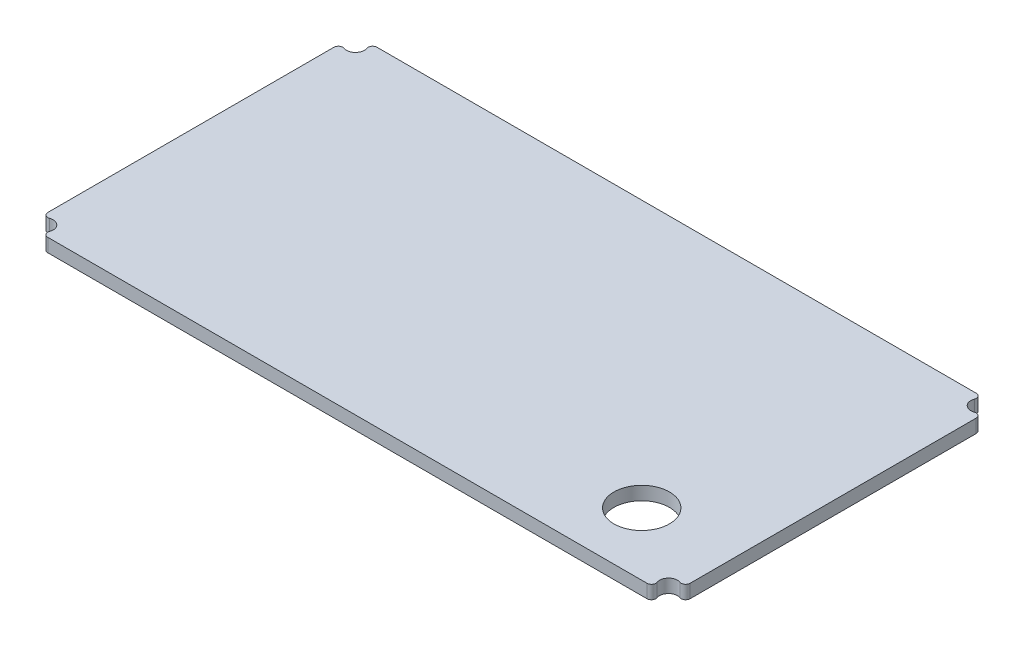
ISO-10303-21;
HEADER;
FILE_DESCRIPTION(('STEP AP214'),'2;1');
FILE_NAME('part.step','',(''),(''),'','','');
FILE_SCHEMA(('AUTOMOTIVE_DESIGN { 1 0 10303 214 1 1 1 1 }'));
ENDSEC;
DATA;
#1=APPLICATION_CONTEXT('core data for automotive mechanical design processes');
#2=APPLICATION_PROTOCOL_DEFINITION('international standard','automotive_design',2000,#1);
#3=PRODUCT_CONTEXT('',#1,'mechanical');
#4=PRODUCT('Part','Part','',(#3));
#5=PRODUCT_RELATED_PRODUCT_CATEGORY('part','',(#4));
#6=PRODUCT_DEFINITION_FORMATION('','',#4);
#7=PRODUCT_DEFINITION_CONTEXT('part definition',#1,'design');
#8=PRODUCT_DEFINITION('design','',#6,#7);
#9=PRODUCT_DEFINITION_SHAPE('','',#8);
#10=(LENGTH_UNIT() NAMED_UNIT(*) SI_UNIT(.MILLI.,.METRE.));
#11=(NAMED_UNIT(*) PLANE_ANGLE_UNIT() SI_UNIT($,.RADIAN.));
#12=(NAMED_UNIT(*) SI_UNIT($,.STERADIAN.) SOLID_ANGLE_UNIT());
#13=UNCERTAINTY_MEASURE_WITH_UNIT(LENGTH_MEASURE(1.E-05),#10,'distance_accuracy_value','');
#14=(GEOMETRIC_REPRESENTATION_CONTEXT(3) GLOBAL_UNCERTAINTY_ASSIGNED_CONTEXT((#13)) GLOBAL_UNIT_ASSIGNED_CONTEXT((#10,
#11,#12)) REPRESENTATION_CONTEXT('',''));
#15=CARTESIAN_POINT('',(0.,0.,0.));
#16=DIRECTION('',(0.,0.,1.));
#17=DIRECTION('',(1.,0.,0.));
#18=AXIS2_PLACEMENT_3D('',#15,#16,#17);
#19=CARTESIAN_POINT('',(69.3857864376269,1.5,-36.3));
#20=DIRECTION('',(0.,-1.,0.));
#21=DIRECTION('',(0.,0.,-1.));
#22=AXIS2_PLACEMENT_3D('',#19,#20,#21);
#23=CYLINDRICAL_SURFACE('',#22,0.499999999999999);
#24=CARTESIAN_POINT('',(69.3857864376269,0.,-36.3));
#25=DIRECTION('',(0.,1.,0.));
#26=DIRECTION('',(0.,0.,1.));
#27=AXIS2_PLACEMENT_3D('',#24,#25,#26);
#28=CIRCLE('',#27,0.499999999999999);
#29=CARTESIAN_POINT('',(69.8571909584179,0.,-36.1333333333333));
#30=VERTEX_POINT('',#29);
#31=CARTESIAN_POINT('',(69.3857864376269,0.,-36.8));
#32=VERTEX_POINT('',#31);
#33=EDGE_CURVE('E177',#30,#32,#28,.T.);
#34=ORIENTED_EDGE('',*,*,#33,.T.);
#35=DIRECTION('',(0.,-1.,0.));
#36=VECTOR('',#35,1.);
#37=CARTESIAN_POINT('',(69.3857864376269,1.5,-36.8));
#38=LINE('',#37,#36);
#39=CARTESIAN_POINT('',(69.3857864376269,1.5,-36.8));
#40=VERTEX_POINT('',#39);
#41=EDGE_CURVE('E11',#40,#32,#38,.T.);
#42=ORIENTED_EDGE('',*,*,#41,.F.);
#43=CARTESIAN_POINT('',(69.3857864376269,1.5,-36.3));
#44=DIRECTION('',(0.,1.,0.));
#45=DIRECTION('',(0.,0.,1.));
#46=AXIS2_PLACEMENT_3D('',#43,#44,#45);
#47=CIRCLE('',#46,0.499999999999999);
#48=CARTESIAN_POINT('',(69.8571909584179,1.5,-36.1333333333333));
#49=VERTEX_POINT('',#48);
#50=EDGE_CURVE('E208',#49,#40,#47,.T.);
#51=ORIENTED_EDGE('',*,*,#50,.F.);
#52=DIRECTION('',(0.,-1.,0.));
#53=VECTOR('',#52,1.);
#54=CARTESIAN_POINT('',(69.8571909584179,1.5,-36.1333333333333));
#55=LINE('',#54,#53);
#56=EDGE_CURVE('E173',#49,#30,#55,.T.);
#57=ORIENTED_EDGE('',*,*,#56,.T.);
#58=EDGE_LOOP('',(#34,#42,#51,#57));
#59=FACE_BOUND('',#58,.T.);
#60=ADVANCED_FACE('F33',(#59),#23,.T.);
#61=CARTESIAN_POINT('',(2.4142135623731,1.5,-36.8));
#62=DIRECTION('',(0.,0.,1.));
#63=DIRECTION('',(1.,0.,0.));
#64=AXIS2_PLACEMENT_3D('',#61,#62,#63);
#65=PLANE('',#64);
#66=DIRECTION('',(-1.,0.,0.));
#67=VECTOR('',#66,1.);
#68=CARTESIAN_POINT('',(2.4142135623731,0.,-36.8));
#69=LINE('',#68,#67);
#70=CARTESIAN_POINT('',(2.4142135623731,0.,-36.8));
#71=VERTEX_POINT('',#70);
#72=EDGE_CURVE('E180',#32,#71,#69,.T.);
#73=ORIENTED_EDGE('',*,*,#72,.T.);
#74=DIRECTION('',(0.,-1.,0.));
#75=VECTOR('',#74,1.);
#76=CARTESIAN_POINT('',(2.4142135623731,1.5,-36.8));
#77=LINE('',#76,#75);
#78=CARTESIAN_POINT('',(2.4142135623731,1.5,-36.8));
#79=VERTEX_POINT('',#78);
#80=EDGE_CURVE('E41',#79,#71,#77,.T.);
#81=ORIENTED_EDGE('',*,*,#80,.F.);
#82=DIRECTION('',(-1.,0.,0.));
#83=VECTOR('',#82,1.);
#84=CARTESIAN_POINT('',(2.4142135623731,1.5,-36.8));
#85=LINE('',#84,#83);
#86=EDGE_CURVE('E116',#40,#79,#85,.T.);
#87=ORIENTED_EDGE('',*,*,#86,.F.);
#88=ORIENTED_EDGE('',*,*,#41,.T.);
#89=EDGE_LOOP('',(#73,#81,#87,#88));
#90=FACE_BOUND('',#89,.T.);
#91=ADVANCED_FACE('F307',(#90),#65,.F.);
#92=CARTESIAN_POINT('',(2.4142135623731,1.5,-36.3));
#93=DIRECTION('',(0.,-1.,0.));
#94=DIRECTION('',(0.,0.,-1.));
#95=AXIS2_PLACEMENT_3D('',#92,#93,#94);
#96=CYLINDRICAL_SURFACE('',#95,0.500000000000001);
#97=CARTESIAN_POINT('',(2.4142135623731,0.,-36.3));
#98=DIRECTION('',(0.,1.,0.));
#99=DIRECTION('',(0.,0.,1.));
#100=AXIS2_PLACEMENT_3D('',#97,#98,#99);
#101=CIRCLE('',#100,0.500000000000001);
#102=CARTESIAN_POINT('',(1.94280904158206,0.,-36.1333333333333));
#103=VERTEX_POINT('',#102);
#104=EDGE_CURVE('E183',#71,#103,#101,.T.);
#105=ORIENTED_EDGE('',*,*,#104,.T.);
#106=DIRECTION('',(0.,-1.,0.));
#107=VECTOR('',#106,1.);
#108=CARTESIAN_POINT('',(1.94280904158206,1.5,-36.1333333333333));
#109=LINE('',#108,#107);
#110=CARTESIAN_POINT('',(1.94280904158206,1.5,-36.1333333333333));
#111=VERTEX_POINT('',#110);
#112=EDGE_CURVE('E239',#111,#103,#109,.T.);
#113=ORIENTED_EDGE('',*,*,#112,.F.);
#114=CARTESIAN_POINT('',(2.4142135623731,1.5,-36.3));
#115=DIRECTION('',(0.,1.,0.));
#116=DIRECTION('',(0.,0.,1.));
#117=AXIS2_PLACEMENT_3D('',#114,#115,#116);
#118=CIRCLE('',#117,0.500000000000001);
#119=EDGE_CURVE('E247',#79,#111,#118,.T.);
#120=ORIENTED_EDGE('',*,*,#119,.F.);
#121=ORIENTED_EDGE('',*,*,#80,.T.);
#122=EDGE_LOOP('',(#105,#113,#120,#121));
#123=FACE_BOUND('',#122,.T.);
#124=ADVANCED_FACE('F245',(#123),#96,.T.);
#125=CARTESIAN_POINT('',(1.,1.5,-35.8));
#126=DIRECTION('',(0.,-1.,0.));
#127=DIRECTION('',(0.,0.,-1.));
#128=AXIS2_PLACEMENT_3D('',#125,#126,#127);
#129=CYLINDRICAL_SURFACE('',#128,0.999999999999998);
#130=CARTESIAN_POINT('',(1.,0.,-35.8));
#131=DIRECTION('',(0.,-1.,0.));
#132=DIRECTION('',(0.,0.,1.));
#133=AXIS2_PLACEMENT_3D('',#130,#131,#132);
#134=CIRCLE('',#133,0.999999999999998);
#135=CARTESIAN_POINT('',(0.666666666666666,0.,-34.8571909584179));
#136=VERTEX_POINT('',#135);
#137=EDGE_CURVE('E185',#103,#136,#134,.T.);
#138=ORIENTED_EDGE('',*,*,#137,.T.);
#139=DIRECTION('',(0.,-1.,0.));
#140=VECTOR('',#139,1.);
#141=CARTESIAN_POINT('',(0.666666666666666,1.5,-34.8571909584179));
#142=LINE('',#141,#140);
#143=CARTESIAN_POINT('',(0.666666666666666,1.5,-34.8571909584179));
#144=VERTEX_POINT('',#143);
#145=EDGE_CURVE('E236',#144,#136,#142,.T.);
#146=ORIENTED_EDGE('',*,*,#145,.F.);
#147=CARTESIAN_POINT('',(1.,1.5,-35.8));
#148=DIRECTION('',(0.,-1.,0.));
#149=DIRECTION('',(0.,0.,1.));
#150=AXIS2_PLACEMENT_3D('',#147,#148,#149);
#151=CIRCLE('',#150,0.999999999999998);
#152=EDGE_CURVE('E265',#111,#144,#151,.T.);
#153=ORIENTED_EDGE('',*,*,#152,.F.);
#154=ORIENTED_EDGE('',*,*,#112,.T.);
#155=EDGE_LOOP('',(#138,#146,#153,#154));
#156=FACE_BOUND('',#155,.T.);
#157=ADVANCED_FACE('F256',(#156),#129,.F.);
#158=CARTESIAN_POINT('',(0.5,1.5,-34.3857864376269));
#159=DIRECTION('',(0.,-1.,0.));
#160=DIRECTION('',(0.,0.,-1.));
#161=AXIS2_PLACEMENT_3D('',#158,#159,#160);
#162=CYLINDRICAL_SURFACE('',#161,0.500000000000003);
#163=CARTESIAN_POINT('',(0.5,0.,-34.3857864376269));
#164=DIRECTION('',(0.,1.,0.));
#165=DIRECTION('',(0.,0.,-1.));
#166=AXIS2_PLACEMENT_3D('',#163,#164,#165);
#167=CIRCLE('',#166,0.500000000000003);
#168=CARTESIAN_POINT('',(0.,0.,-34.3857864376269));
#169=VERTEX_POINT('',#168);
#170=EDGE_CURVE('E187',#136,#169,#167,.T.);
#171=ORIENTED_EDGE('',*,*,#170,.T.);
#172=DIRECTION('',(0.,-1.,0.));
#173=VECTOR('',#172,1.);
#174=CARTESIAN_POINT('',(0.,1.5,-34.3857864376269));
#175=LINE('',#174,#173);
#176=CARTESIAN_POINT('',(0.,1.5,-34.3857864376269));
#177=VERTEX_POINT('',#176);
#178=EDGE_CURVE('E233',#177,#169,#175,.T.);
#179=ORIENTED_EDGE('',*,*,#178,.F.);
#180=CARTESIAN_POINT('',(0.5,1.5,-34.3857864376269));
#181=DIRECTION('',(0.,1.,0.));
#182=DIRECTION('',(0.,0.,-1.));
#183=AXIS2_PLACEMENT_3D('',#180,#181,#182);
#184=CIRCLE('',#183,0.500000000000003);
#185=EDGE_CURVE('E262',#144,#177,#184,.T.);
#186=ORIENTED_EDGE('',*,*,#185,.F.);
#187=ORIENTED_EDGE('',*,*,#145,.T.);
#188=EDGE_LOOP('',(#171,#179,#186,#187));
#189=FACE_BOUND('',#188,.T.);
#190=ADVANCED_FACE('F260',(#189),#162,.T.);
#191=CARTESIAN_POINT('',(0.,1.5,-2.4142135623731));
#192=DIRECTION('',(1.,0.,0.));
#193=DIRECTION('',(0.,0.,-1.));
#194=AXIS2_PLACEMENT_3D('',#191,#192,#193);
#195=PLANE('',#194);
#196=DIRECTION('',(0.,0.,1.));
#197=VECTOR('',#196,1.);
#198=CARTESIAN_POINT('',(0.,0.,-2.4142135623731));
#199=LINE('',#198,#197);
#200=CARTESIAN_POINT('',(0.,0.,-2.4142135623731));
#201=VERTEX_POINT('',#200);
#202=EDGE_CURVE('E189',#169,#201,#199,.T.);
#203=ORIENTED_EDGE('',*,*,#202,.T.);
#204=DIRECTION('',(0.,-1.,0.));
#205=VECTOR('',#204,1.);
#206=CARTESIAN_POINT('',(0.,1.5,-2.4142135623731));
#207=LINE('',#206,#205);
#208=CARTESIAN_POINT('',(0.,1.5,-2.4142135623731));
#209=VERTEX_POINT('',#208);
#210=EDGE_CURVE('E230',#209,#201,#207,.T.);
#211=ORIENTED_EDGE('',*,*,#210,.F.);
#212=DIRECTION('',(0.,0.,1.));
#213=VECTOR('',#212,1.);
#214=CARTESIAN_POINT('',(0.,1.5,-2.4142135623731));
#215=LINE('',#214,#213);
#216=EDGE_CURVE('E264',#177,#209,#215,.T.);
#217=ORIENTED_EDGE('',*,*,#216,.F.);
#218=ORIENTED_EDGE('',*,*,#178,.T.);
#219=EDGE_LOOP('',(#203,#211,#217,#218));
#220=FACE_BOUND('',#219,.T.);
#221=ADVANCED_FACE('F320',(#220),#195,.F.);
#222=CARTESIAN_POINT('',(0.5,1.5,-2.4142135623731));
#223=DIRECTION('',(0.,-1.,0.));
#224=DIRECTION('',(0.,0.,-1.));
#225=AXIS2_PLACEMENT_3D('',#222,#223,#224);
#226=CYLINDRICAL_SURFACE('',#225,0.5);
#227=CARTESIAN_POINT('',(0.5,0.,-2.4142135623731));
#228=DIRECTION('',(0.,1.,0.));
#229=DIRECTION('',(0.,0.,1.));
#230=AXIS2_PLACEMENT_3D('',#227,#228,#229);
#231=CIRCLE('',#230,0.5);
#232=CARTESIAN_POINT('',(0.666666666666667,0.,-1.94280904158206));
#233=VERTEX_POINT('',#232);
#234=EDGE_CURVE('E191',#201,#233,#231,.T.);
#235=ORIENTED_EDGE('',*,*,#234,.T.);
#236=DIRECTION('',(0.,-1.,0.));
#237=VECTOR('',#236,1.);
#238=CARTESIAN_POINT('',(0.666666666666667,1.5,-1.94280904158206));
#239=LINE('',#238,#237);
#240=CARTESIAN_POINT('',(0.666666666666667,1.5,-1.94280904158206));
#241=VERTEX_POINT('',#240);
#242=EDGE_CURVE('E227',#241,#233,#239,.T.);
#243=ORIENTED_EDGE('',*,*,#242,.F.);
#244=CARTESIAN_POINT('',(0.5,1.5,-2.4142135623731));
#245=DIRECTION('',(0.,1.,0.));
#246=DIRECTION('',(0.,0.,1.));
#247=AXIS2_PLACEMENT_3D('',#244,#245,#246);
#248=CIRCLE('',#247,0.5);
#249=EDGE_CURVE('E267',#209,#241,#248,.T.);
#250=ORIENTED_EDGE('',*,*,#249,.F.);
#251=ORIENTED_EDGE('',*,*,#210,.T.);
#252=EDGE_LOOP('',(#235,#243,#250,#251));
#253=FACE_BOUND('',#252,.T.);
#254=ADVANCED_FACE('F323',(#253),#226,.T.);
#255=CARTESIAN_POINT('',(1.,1.5,-1.));
#256=DIRECTION('',(0.,-1.,0.));
#257=DIRECTION('',(0.,0.,-1.));
#258=AXIS2_PLACEMENT_3D('',#255,#256,#257);
#259=CYLINDRICAL_SURFACE('',#258,1.);
#260=CARTESIAN_POINT('',(1.,0.,-1.));
#261=DIRECTION('',(0.,-1.,0.));
#262=DIRECTION('',(0.,0.,1.));
#263=AXIS2_PLACEMENT_3D('',#260,#261,#262);
#264=CIRCLE('',#263,1.);
#265=CARTESIAN_POINT('',(1.94280904158206,0.,-0.666666666666667));
#266=VERTEX_POINT('',#265);
#267=EDGE_CURVE('E193',#233,#266,#264,.T.);
#268=ORIENTED_EDGE('',*,*,#267,.T.);
#269=DIRECTION('',(0.,-1.,0.));
#270=VECTOR('',#269,1.);
#271=CARTESIAN_POINT('',(1.94280904158206,1.5,-0.666666666666667));
#272=LINE('',#271,#270);
#273=CARTESIAN_POINT('',(1.94280904158206,1.5,-0.666666666666667));
#274=VERTEX_POINT('',#273);
#275=EDGE_CURVE('E224',#274,#266,#272,.T.);
#276=ORIENTED_EDGE('',*,*,#275,.F.);
#277=CARTESIAN_POINT('',(1.,1.5,-1.));
#278=DIRECTION('',(0.,-1.,0.));
#279=DIRECTION('',(0.,0.,1.));
#280=AXIS2_PLACEMENT_3D('',#277,#278,#279);
#281=CIRCLE('',#280,1.);
#282=EDGE_CURVE('E273',#241,#274,#281,.T.);
#283=ORIENTED_EDGE('',*,*,#282,.F.);
#284=ORIENTED_EDGE('',*,*,#242,.T.);
#285=EDGE_LOOP('',(#268,#276,#283,#284));
#286=FACE_BOUND('',#285,.T.);
#287=ADVANCED_FACE('F327',(#286),#259,.F.);
#288=CARTESIAN_POINT('',(2.4142135623731,1.5,-0.5));
#289=DIRECTION('',(0.,-1.,0.));
#290=DIRECTION('',(0.,0.,-1.));
#291=AXIS2_PLACEMENT_3D('',#288,#289,#290);
#292=CYLINDRICAL_SURFACE('',#291,0.5);
#293=CARTESIAN_POINT('',(2.4142135623731,0.,-0.5));
#294=DIRECTION('',(0.,1.,0.));
#295=DIRECTION('',(0.,0.,-1.));
#296=AXIS2_PLACEMENT_3D('',#293,#294,#295);
#297=CIRCLE('',#296,0.5);
#298=CARTESIAN_POINT('',(2.4142135623731,0.,0.));
#299=VERTEX_POINT('',#298);
#300=EDGE_CURVE('E195',#266,#299,#297,.T.);
#301=ORIENTED_EDGE('',*,*,#300,.T.);
#302=DIRECTION('',(0.,-1.,0.));
#303=VECTOR('',#302,1.);
#304=CARTESIAN_POINT('',(2.4142135623731,1.5,0.));
#305=LINE('',#304,#303);
#306=CARTESIAN_POINT('',(2.4142135623731,1.5,0.));
#307=VERTEX_POINT('',#306);
#308=EDGE_CURVE('E221',#307,#299,#305,.T.);
#309=ORIENTED_EDGE('',*,*,#308,.F.);
#310=CARTESIAN_POINT('',(2.4142135623731,1.5,-0.5));
#311=DIRECTION('',(0.,1.,0.));
#312=DIRECTION('',(0.,0.,-1.));
#313=AXIS2_PLACEMENT_3D('',#310,#311,#312);
#314=CIRCLE('',#313,0.5);
#315=EDGE_CURVE('E275',#274,#307,#314,.T.);
#316=ORIENTED_EDGE('',*,*,#315,.F.);
#317=ORIENTED_EDGE('',*,*,#275,.T.);
#318=EDGE_LOOP('',(#301,#309,#316,#317));
#319=FACE_BOUND('',#318,.T.);
#320=ADVANCED_FACE('F331',(#319),#292,.T.);
#321=CARTESIAN_POINT('',(2.4142135623731,1.5,0.));
#322=DIRECTION('',(0.,0.,-1.));
#323=DIRECTION('',(-1.,0.,0.));
#324=AXIS2_PLACEMENT_3D('',#321,#322,#323);
#325=PLANE('',#324);
#326=DIRECTION('',(1.,0.,0.));
#327=VECTOR('',#326,1.);
#328=CARTESIAN_POINT('',(2.4142135623731,0.,0.));
#329=LINE('',#328,#327);
#330=CARTESIAN_POINT('',(69.3857864376269,0.,0.));
#331=VERTEX_POINT('',#330);
#332=EDGE_CURVE('E197',#299,#331,#329,.T.);
#333=ORIENTED_EDGE('',*,*,#332,.T.);
#334=DIRECTION('',(0.,-1.,0.));
#335=VECTOR('',#334,1.);
#336=CARTESIAN_POINT('',(69.3857864376269,1.5,0.));
#337=LINE('',#336,#335);
#338=CARTESIAN_POINT('',(69.3857864376269,1.5,0.));
#339=VERTEX_POINT('',#338);
#340=EDGE_CURVE('E218',#339,#331,#337,.T.);
#341=ORIENTED_EDGE('',*,*,#340,.F.);
#342=DIRECTION('',(1.,0.,0.));
#343=VECTOR('',#342,1.);
#344=CARTESIAN_POINT('',(2.4142135623731,1.5,0.));
#345=LINE('',#344,#343);
#346=EDGE_CURVE('E277',#307,#339,#345,.T.);
#347=ORIENTED_EDGE('',*,*,#346,.F.);
#348=ORIENTED_EDGE('',*,*,#308,.T.);
#349=EDGE_LOOP('',(#333,#341,#347,#348));
#350=FACE_BOUND('',#349,.T.);
#351=ADVANCED_FACE('F335',(#350),#325,.F.);
#352=CARTESIAN_POINT('',(69.3857864376269,1.5,-0.5));
#353=DIRECTION('',(0.,-1.,0.));
#354=DIRECTION('',(0.,0.,-1.));
#355=AXIS2_PLACEMENT_3D('',#352,#353,#354);
#356=CYLINDRICAL_SURFACE('',#355,0.499999999999999);
#357=CARTESIAN_POINT('',(69.3857864376269,0.,-0.5));
#358=DIRECTION('',(0.,1.,0.));
#359=DIRECTION('',(0.,0.,-1.));
#360=AXIS2_PLACEMENT_3D('',#357,#358,#359);
#361=CIRCLE('',#360,0.499999999999999);
#362=CARTESIAN_POINT('',(69.8571909584179,0.,-0.666666666666665));
#363=VERTEX_POINT('',#362);
#364=EDGE_CURVE('E199',#331,#363,#361,.T.);
#365=ORIENTED_EDGE('',*,*,#364,.T.);
#366=DIRECTION('',(0.,-1.,0.));
#367=VECTOR('',#366,1.);
#368=CARTESIAN_POINT('',(69.8571909584179,1.5,-0.666666666666665));
#369=LINE('',#368,#367);
#370=CARTESIAN_POINT('',(69.8571909584179,1.5,-0.666666666666665));
#371=VERTEX_POINT('',#370);
#372=EDGE_CURVE('E215',#371,#363,#369,.T.);
#373=ORIENTED_EDGE('',*,*,#372,.F.);
#374=CARTESIAN_POINT('',(69.3857864376269,1.5,-0.5));
#375=DIRECTION('',(0.,1.,0.));
#376=DIRECTION('',(0.,0.,-1.));
#377=AXIS2_PLACEMENT_3D('',#374,#375,#376);
#378=CIRCLE('',#377,0.499999999999999);
#379=EDGE_CURVE('E279',#339,#371,#378,.T.);
#380=ORIENTED_EDGE('',*,*,#379,.F.);
#381=ORIENTED_EDGE('',*,*,#340,.T.);
#382=EDGE_LOOP('',(#365,#373,#380,#381));
#383=FACE_BOUND('',#382,.T.);
#384=ADVANCED_FACE('F339',(#383),#356,.T.);
#385=CARTESIAN_POINT('',(70.8,1.5,-1.));
#386=DIRECTION('',(0.,-1.,0.));
#387=DIRECTION('',(0.,0.,-1.));
#388=AXIS2_PLACEMENT_3D('',#385,#386,#387);
#389=CYLINDRICAL_SURFACE('',#388,1.);
#390=CARTESIAN_POINT('',(70.8,0.,-1.));
#391=DIRECTION('',(0.,-1.,0.));
#392=DIRECTION('',(0.,0.,1.));
#393=AXIS2_PLACEMENT_3D('',#390,#391,#392);
#394=CIRCLE('',#393,1.);
#395=CARTESIAN_POINT('',(71.1333333333333,0.,-1.94280904158206));
#396=VERTEX_POINT('',#395);
#397=EDGE_CURVE('E201',#363,#396,#394,.T.);
#398=ORIENTED_EDGE('',*,*,#397,.T.);
#399=DIRECTION('',(0.,-1.,0.));
#400=VECTOR('',#399,1.);
#401=CARTESIAN_POINT('',(71.1333333333333,1.5,-1.94280904158206));
#402=LINE('',#401,#400);
#403=CARTESIAN_POINT('',(71.1333333333333,1.5,-1.94280904158206));
#404=VERTEX_POINT('',#403);
#405=EDGE_CURVE('E212',#404,#396,#402,.T.);
#406=ORIENTED_EDGE('',*,*,#405,.F.);
#407=CARTESIAN_POINT('',(70.8,1.5,-1.));
#408=DIRECTION('',(0.,-1.,0.));
#409=DIRECTION('',(0.,0.,1.));
#410=AXIS2_PLACEMENT_3D('',#407,#408,#409);
#411=CIRCLE('',#410,1.);
#412=EDGE_CURVE('E281',#371,#404,#411,.T.);
#413=ORIENTED_EDGE('',*,*,#412,.F.);
#414=ORIENTED_EDGE('',*,*,#372,.T.);
#415=EDGE_LOOP('',(#398,#406,#413,#414));
#416=FACE_BOUND('',#415,.T.);
#417=ADVANCED_FACE('F287',(#416),#389,.F.);
#418=CARTESIAN_POINT('',(71.3,1.5,-2.4142135623731));
#419=DIRECTION('',(0.,-1.,0.));
#420=DIRECTION('',(0.,0.,-1.));
#421=AXIS2_PLACEMENT_3D('',#418,#419,#420);
#422=CYLINDRICAL_SURFACE('',#421,0.499999999999999);
#423=CARTESIAN_POINT('',(71.3,0.,-2.4142135623731));
#424=DIRECTION('',(0.,1.,0.));
#425=DIRECTION('',(0.,0.,1.));
#426=AXIS2_PLACEMENT_3D('',#423,#424,#425);
#427=CIRCLE('',#426,0.499999999999999);
#428=CARTESIAN_POINT('',(71.8,0.,-2.4142135623731));
#429=VERTEX_POINT('',#428);
#430=EDGE_CURVE('E203',#396,#429,#427,.T.);
#431=ORIENTED_EDGE('',*,*,#430,.T.);
#432=DIRECTION('',(0.,-1.,0.));
#433=VECTOR('',#432,1.);
#434=CARTESIAN_POINT('',(71.8,1.5,-2.4142135623731));
#435=LINE('',#434,#433);
#436=CARTESIAN_POINT('',(71.8,1.5,-2.4142135623731));
#437=VERTEX_POINT('',#436);
#438=EDGE_CURVE('E168',#437,#429,#435,.T.);
#439=ORIENTED_EDGE('',*,*,#438,.F.);
#440=CARTESIAN_POINT('',(71.3,1.5,-2.4142135623731));
#441=DIRECTION('',(0.,1.,0.));
#442=DIRECTION('',(0.,0.,1.));
#443=AXIS2_PLACEMENT_3D('',#440,#441,#442);
#444=CIRCLE('',#443,0.499999999999999);
#445=EDGE_CURVE('E159',#404,#437,#444,.T.);
#446=ORIENTED_EDGE('',*,*,#445,.F.);
#447=ORIENTED_EDGE('',*,*,#405,.T.);
#448=EDGE_LOOP('',(#431,#439,#446,#447));
#449=FACE_BOUND('',#448,.T.);
#450=ADVANCED_FACE('F291',(#449),#422,.T.);
#451=CARTESIAN_POINT('',(71.8,1.5,-2.4142135623731));
#452=DIRECTION('',(-1.,0.,0.));
#453=DIRECTION('',(0.,0.,1.));
#454=AXIS2_PLACEMENT_3D('',#451,#452,#453);
#455=PLANE('',#454);
#456=DIRECTION('',(0.,0.,-1.));
#457=VECTOR('',#456,1.);
#458=CARTESIAN_POINT('',(71.8,0.,-2.4142135623731));
#459=LINE('',#458,#457);
#460=CARTESIAN_POINT('',(71.8,0.,-34.3857864376269));
#461=VERTEX_POINT('',#460);
#462=EDGE_CURVE('E167',#429,#461,#459,.T.);
#463=ORIENTED_EDGE('',*,*,#462,.T.);
#464=DIRECTION('',(0.,-1.,0.));
#465=VECTOR('',#464,1.);
#466=CARTESIAN_POINT('',(71.8,1.5,-34.3857864376269));
#467=LINE('',#466,#465);
#468=CARTESIAN_POINT('',(71.8,1.5,-34.3857864376269));
#469=VERTEX_POINT('',#468);
#470=EDGE_CURVE('E164',#469,#461,#467,.T.);
#471=ORIENTED_EDGE('',*,*,#470,.F.);
#472=DIRECTION('',(0.,0.,-1.));
#473=VECTOR('',#472,1.);
#474=CARTESIAN_POINT('',(71.8,1.5,-2.4142135623731));
#475=LINE('',#474,#473);
#476=EDGE_CURVE('E153',#437,#469,#475,.T.);
#477=ORIENTED_EDGE('',*,*,#476,.F.);
#478=ORIENTED_EDGE('',*,*,#438,.T.);
#479=EDGE_LOOP('',(#463,#471,#477,#478));
#480=FACE_BOUND('',#479,.T.);
#481=ADVANCED_FACE('F165',(#480),#455,.F.);
#482=CARTESIAN_POINT('',(71.3,1.5,-34.3857864376269));
#483=DIRECTION('',(0.,-1.,0.));
#484=DIRECTION('',(0.,0.,-1.));
#485=AXIS2_PLACEMENT_3D('',#482,#483,#484);
#486=CYLINDRICAL_SURFACE('',#485,0.499999999999999);
#487=CARTESIAN_POINT('',(71.3,0.,-34.3857864376269));
#488=DIRECTION('',(0.,1.,0.));
#489=DIRECTION('',(0.,0.,1.));
#490=AXIS2_PLACEMENT_3D('',#487,#488,#489);
#491=CIRCLE('',#490,0.499999999999999);
#492=CARTESIAN_POINT('',(71.1333333333333,0.,-34.8571909584179));
#493=VERTEX_POINT('',#492);
#494=EDGE_CURVE('E102',#461,#493,#491,.T.);
#495=ORIENTED_EDGE('',*,*,#494,.T.);
#496=DIRECTION('',(0.,-1.,0.));
#497=VECTOR('',#496,1.);
#498=CARTESIAN_POINT('',(71.1333333333333,1.5,-34.8571909584179));
#499=LINE('',#498,#497);
#500=CARTESIAN_POINT('',(71.1333333333333,1.5,-34.8571909584179));
#501=VERTEX_POINT('',#500);
#502=EDGE_CURVE('E169',#501,#493,#499,.T.);
#503=ORIENTED_EDGE('',*,*,#502,.F.);
#504=CARTESIAN_POINT('',(71.3,1.5,-34.3857864376269));
#505=DIRECTION('',(0.,1.,0.));
#506=DIRECTION('',(0.,0.,1.));
#507=AXIS2_PLACEMENT_3D('',#504,#505,#506);
#508=CIRCLE('',#507,0.499999999999999);
#509=EDGE_CURVE('E157',#469,#501,#508,.T.);
#510=ORIENTED_EDGE('',*,*,#509,.F.);
#511=ORIENTED_EDGE('',*,*,#470,.T.);
#512=EDGE_LOOP('',(#495,#503,#510,#511));
#513=FACE_BOUND('',#512,.T.);
#514=ADVANCED_FACE('F171',(#513),#486,.T.);
#515=CARTESIAN_POINT('',(70.8,1.5,-35.8));
#516=DIRECTION('',(0.,-1.,0.));
#517=DIRECTION('',(0.,0.,-1.));
#518=AXIS2_PLACEMENT_3D('',#515,#516,#517);
#519=CYLINDRICAL_SURFACE('',#518,1.);
#520=CARTESIAN_POINT('',(70.8,0.,-35.8));
#521=DIRECTION('',(0.,-1.,0.));
#522=DIRECTION('',(0.,0.,1.));
#523=AXIS2_PLACEMENT_3D('',#520,#521,#522);
#524=CIRCLE('',#523,1.);
#525=EDGE_CURVE('E108',#493,#30,#524,.T.);
#526=ORIENTED_EDGE('',*,*,#525,.T.);
#527=ORIENTED_EDGE('',*,*,#56,.F.);
#528=CARTESIAN_POINT('',(70.8,1.5,-35.8));
#529=DIRECTION('',(0.,-1.,0.));
#530=DIRECTION('',(0.,0.,1.));
#531=AXIS2_PLACEMENT_3D('',#528,#529,#530);
#532=CIRCLE('',#531,1.);
#533=EDGE_CURVE('E49',#501,#49,#532,.T.);
#534=ORIENTED_EDGE('',*,*,#533,.F.);
#535=ORIENTED_EDGE('',*,*,#502,.T.);
#536=EDGE_LOOP('',(#526,#527,#534,#535));
#537=FACE_BOUND('',#536,.T.);
#538=ADVANCED_FACE('F295',(#537),#519,.F.);
#539=CARTESIAN_POINT('',(69.3857864376269,1.5,-36.3));
#540=DIRECTION('',(0.,1.,0.));
#541=DIRECTION('',(0.,0.,1.));
#542=AXIS2_PLACEMENT_3D('',#539,#540,#541);
#543=PLANE('',#542);
#544=CARTESIAN_POINT('',(61.8,1.5,-7.));
#545=DIRECTION('',(0.,1.,0.));
#546=DIRECTION('',(0.,0.,1.));
#547=AXIS2_PLACEMENT_3D('',#544,#545,#546);
#548=CIRCLE('',#547,3.1);
#549=CARTESIAN_POINT('',(61.8,1.5,-3.90000000000001));
#550=VERTEX_POINT('',#549);
#551=EDGE_CURVE('E394',#550,#550,#548,.T.);
#552=ORIENTED_EDGE('',*,*,#551,.F.);
#553=EDGE_LOOP('',(#552));
#554=FACE_BOUND('',#553,.T.);
#555=ORIENTED_EDGE('',*,*,#50,.T.);
#556=ORIENTED_EDGE('',*,*,#86,.T.);
#557=ORIENTED_EDGE('',*,*,#119,.T.);
#558=ORIENTED_EDGE('',*,*,#152,.T.);
#559=ORIENTED_EDGE('',*,*,#185,.T.);
#560=ORIENTED_EDGE('',*,*,#216,.T.);
#561=ORIENTED_EDGE('',*,*,#249,.T.);
#562=ORIENTED_EDGE('',*,*,#282,.T.);
#563=ORIENTED_EDGE('',*,*,#315,.T.);
#564=ORIENTED_EDGE('',*,*,#346,.T.);
#565=ORIENTED_EDGE('',*,*,#379,.T.);
#566=ORIENTED_EDGE('',*,*,#412,.T.);
#567=ORIENTED_EDGE('',*,*,#445,.T.);
#568=ORIENTED_EDGE('',*,*,#476,.T.);
#569=ORIENTED_EDGE('',*,*,#509,.T.);
#570=ORIENTED_EDGE('',*,*,#533,.T.);
#571=EDGE_LOOP('',(#555,#556,#557,#558,#559,#560,#561,#562,#563,#564,#565,#566,#567,#568,#569,#570));
#572=FACE_BOUND('',#571,.T.);
#573=ADVANCED_FACE('F155',(#554,#572),#543,.T.);
#574=CARTESIAN_POINT('',(69.3857864376269,0.,-36.3));
#575=DIRECTION('',(0.,1.,0.));
#576=DIRECTION('',(0.,0.,1.));
#577=AXIS2_PLACEMENT_3D('',#574,#575,#576);
#578=PLANE('',#577);
#579=CARTESIAN_POINT('',(61.8,0.,-7.));
#580=DIRECTION('',(0.,1.,0.));
#581=DIRECTION('',(0.,0.,1.));
#582=AXIS2_PLACEMENT_3D('',#579,#580,#581);
#583=CIRCLE('',#582,3.1);
#584=CARTESIAN_POINT('',(61.8,0.,-3.90000000000001));
#585=VERTEX_POINT('',#584);
#586=EDGE_CURVE('E181',#585,#585,#583,.T.);
#587=ORIENTED_EDGE('',*,*,#586,.T.);
#588=EDGE_LOOP('',(#587));
#589=FACE_BOUND('',#588,.T.);
#590=ORIENTED_EDGE('',*,*,#33,.F.);
#591=ORIENTED_EDGE('',*,*,#525,.F.);
#592=ORIENTED_EDGE('',*,*,#494,.F.);
#593=ORIENTED_EDGE('',*,*,#462,.F.);
#594=ORIENTED_EDGE('',*,*,#430,.F.);
#595=ORIENTED_EDGE('',*,*,#397,.F.);
#596=ORIENTED_EDGE('',*,*,#364,.F.);
#597=ORIENTED_EDGE('',*,*,#332,.F.);
#598=ORIENTED_EDGE('',*,*,#300,.F.);
#599=ORIENTED_EDGE('',*,*,#267,.F.);
#600=ORIENTED_EDGE('',*,*,#234,.F.);
#601=ORIENTED_EDGE('',*,*,#202,.F.);
#602=ORIENTED_EDGE('',*,*,#170,.F.);
#603=ORIENTED_EDGE('',*,*,#137,.F.);
#604=ORIENTED_EDGE('',*,*,#104,.F.);
#605=ORIENTED_EDGE('',*,*,#72,.F.);
#606=EDGE_LOOP('',(#590,#591,#592,#593,#594,#595,#596,#597,#598,#599,#600,#601,#602,#603,#604,#605));
#607=FACE_BOUND('',#606,.T.);
#608=ADVANCED_FACE('F251',(#589,#607),#578,.F.);
#609=CARTESIAN_POINT('',(61.8,0.,-7.));
#610=DIRECTION('',(0.,1.,0.));
#611=DIRECTION('',(0.,0.,1.));
#612=AXIS2_PLACEMENT_3D('',#609,#610,#611);
#613=CYLINDRICAL_SURFACE('',#612,3.1);
#614=ORIENTED_EDGE('',*,*,#586,.F.);
#615=EDGE_LOOP('',(#614));
#616=FACE_BOUND('',#615,.T.);
#617=ORIENTED_EDGE('',*,*,#551,.T.);
#618=EDGE_LOOP('',(#617));
#619=FACE_BOUND('',#618,.T.);
#620=ADVANCED_FACE('F376',(#616,#619),#613,.F.);
#621=CLOSED_SHELL('',(#60,#91,#124,#157,#190,#221,#254,#287,#320,#351,#384,#417,#450,#481,#514,
#538,#573,#608,#620));
#622=MANIFOLD_SOLID_BREP('B2',#621);
#623=ADVANCED_BREP_SHAPE_REPRESENTATION('',(#18,#622),#14);
#624=SHAPE_DEFINITION_REPRESENTATION(#9,#623);
ENDSEC;
END-ISO-10303-21;
